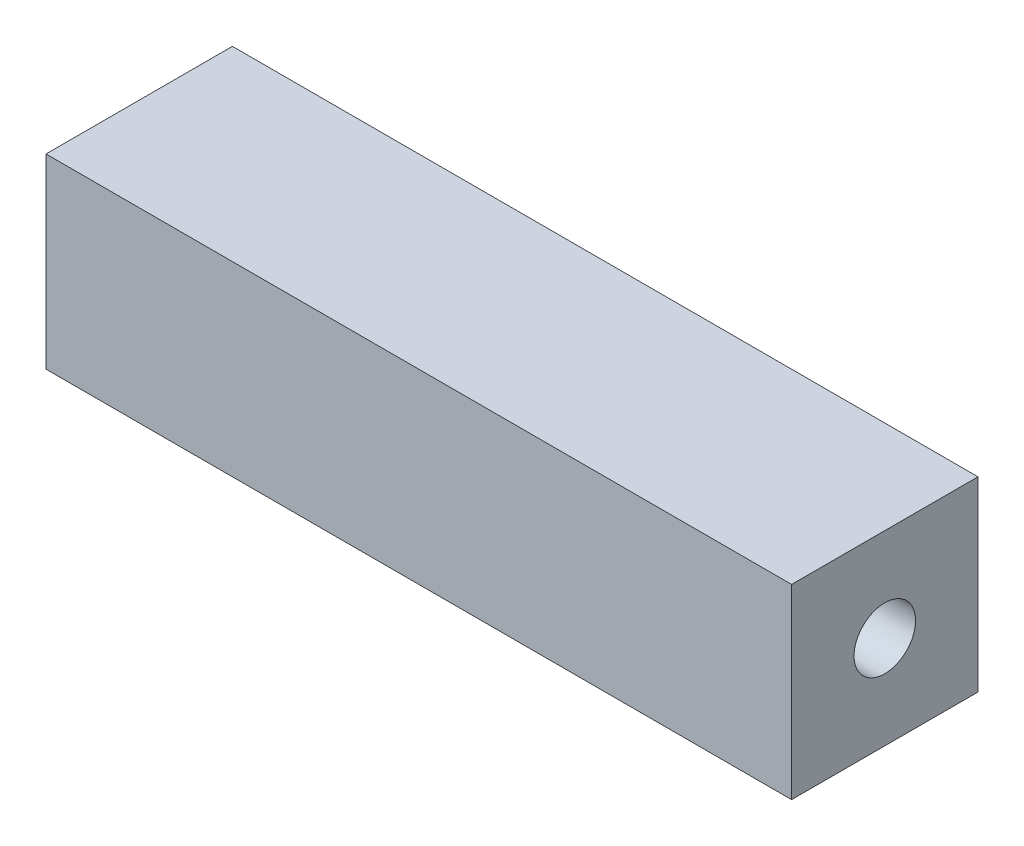
ISO-10303-21;
HEADER;
FILE_DESCRIPTION(('STEP AP214'),'2;1');
FILE_NAME('part.step','',(''),(''),'','','');
FILE_SCHEMA(('AUTOMOTIVE_DESIGN { 1 0 10303 214 1 1 1 1 }'));
ENDSEC;
DATA;
#1=APPLICATION_CONTEXT('core data for automotive mechanical design processes');
#2=APPLICATION_PROTOCOL_DEFINITION('international standard','automotive_design',2000,#1);
#3=PRODUCT_CONTEXT('',#1,'mechanical');
#4=PRODUCT('Part','Part','',(#3));
#5=PRODUCT_RELATED_PRODUCT_CATEGORY('part','',(#4));
#6=PRODUCT_DEFINITION_FORMATION('','',#4);
#7=PRODUCT_DEFINITION_CONTEXT('part definition',#1,'design');
#8=PRODUCT_DEFINITION('design','',#6,#7);
#9=PRODUCT_DEFINITION_SHAPE('','',#8);
#10=(LENGTH_UNIT() NAMED_UNIT(*) SI_UNIT(.MILLI.,.METRE.));
#11=(NAMED_UNIT(*) PLANE_ANGLE_UNIT() SI_UNIT($,.RADIAN.));
#12=(NAMED_UNIT(*) SI_UNIT($,.STERADIAN.) SOLID_ANGLE_UNIT());
#13=UNCERTAINTY_MEASURE_WITH_UNIT(LENGTH_MEASURE(1.E-05),#10,'distance_accuracy_value','');
#14=(GEOMETRIC_REPRESENTATION_CONTEXT(3) GLOBAL_UNCERTAINTY_ASSIGNED_CONTEXT((#13)) GLOBAL_UNIT_ASSIGNED_CONTEXT((#10,
#11,#12)) REPRESENTATION_CONTEXT('',''));
#15=CARTESIAN_POINT('',(0.,0.,0.));
#16=DIRECTION('',(0.,0.,1.));
#17=DIRECTION('',(1.,0.,0.));
#18=AXIS2_PLACEMENT_3D('',#15,#16,#17);
#19=CARTESIAN_POINT('',(20.,10.,-5.));
#20=DIRECTION('',(-1.,0.,0.));
#21=DIRECTION('',(0.,0.,1.));
#22=AXIS2_PLACEMENT_3D('',#19,#20,#21);
#23=PLANE('',#22);
#24=CARTESIAN_POINT('',(20.,5.,0.));
#25=DIRECTION('',(1.,0.,0.));
#26=DIRECTION('',(0.,0.,-1.));
#27=AXIS2_PLACEMENT_3D('',#24,#25,#26);
#28=CIRCLE('',#27,1.65);
#29=CARTESIAN_POINT('',(20.,5.,-1.65));
#30=VERTEX_POINT('',#29);
#31=EDGE_CURVE('E106',#30,#30,#28,.T.);
#32=ORIENTED_EDGE('',*,*,#31,.F.);
#33=EDGE_LOOP('',(#32));
#34=FACE_BOUND('',#33,.T.);
#35=DIRECTION('',(0.,0.,-1.));
#36=VECTOR('',#35,1.);
#37=CARTESIAN_POINT('',(20.,0.,-5.));
#38=LINE('',#37,#36);
#39=CARTESIAN_POINT('',(20.,0.,5.));
#40=VERTEX_POINT('',#39);
#41=CARTESIAN_POINT('',(20.,0.,-5.));
#42=VERTEX_POINT('',#41);
#43=EDGE_CURVE('E117',#40,#42,#38,.T.);
#44=ORIENTED_EDGE('',*,*,#43,.T.);
#45=DIRECTION('',(0.,-1.,0.));
#46=VECTOR('',#45,1.);
#47=CARTESIAN_POINT('',(20.,10.,-5.));
#48=LINE('',#47,#46);
#49=CARTESIAN_POINT('',(20.,10.,-5.));
#50=VERTEX_POINT('',#49);
#51=EDGE_CURVE('E11',#50,#42,#48,.T.);
#52=ORIENTED_EDGE('',*,*,#51,.F.);
#53=DIRECTION('',(0.,0.,-1.));
#54=VECTOR('',#53,1.);
#55=CARTESIAN_POINT('',(20.,10.,-5.));
#56=LINE('',#55,#54);
#57=CARTESIAN_POINT('',(20.,10.,5.));
#58=VERTEX_POINT('',#57);
#59=EDGE_CURVE('E118',#58,#50,#56,.T.);
#60=ORIENTED_EDGE('',*,*,#59,.F.);
#61=DIRECTION('',(0.,-1.,0.));
#62=VECTOR('',#61,1.);
#63=CARTESIAN_POINT('',(20.,10.,5.));
#64=LINE('',#63,#62);
#65=EDGE_CURVE('E124',#58,#40,#64,.T.);
#66=ORIENTED_EDGE('',*,*,#65,.T.);
#67=EDGE_LOOP('',(#44,#52,#60,#66));
#68=FACE_BOUND('',#67,.T.);
#69=ADVANCED_FACE('F42',(#34,#68),#23,.F.);
#70=CARTESIAN_POINT('',(-20.,10.,-5.));
#71=DIRECTION('',(0.,0.,1.));
#72=DIRECTION('',(1.,0.,0.));
#73=AXIS2_PLACEMENT_3D('',#70,#71,#72);
#74=PLANE('',#73);
#75=DIRECTION('',(-1.,0.,0.));
#76=VECTOR('',#75,1.);
#77=CARTESIAN_POINT('',(-20.,0.,-5.));
#78=LINE('',#77,#76);
#79=CARTESIAN_POINT('',(-20.,0.,-5.));
#80=VERTEX_POINT('',#79);
#81=EDGE_CURVE('E127',#42,#80,#78,.T.);
#82=ORIENTED_EDGE('',*,*,#81,.T.);
#83=DIRECTION('',(0.,-1.,0.));
#84=VECTOR('',#83,1.);
#85=CARTESIAN_POINT('',(-20.,10.,-5.));
#86=LINE('',#85,#84);
#87=CARTESIAN_POINT('',(-20.,10.,-5.));
#88=VERTEX_POINT('',#87);
#89=EDGE_CURVE('E50',#88,#80,#86,.T.);
#90=ORIENTED_EDGE('',*,*,#89,.F.);
#91=DIRECTION('',(-1.,0.,0.));
#92=VECTOR('',#91,1.);
#93=CARTESIAN_POINT('',(-20.,10.,-5.));
#94=LINE('',#93,#92);
#95=EDGE_CURVE('E89',#50,#88,#94,.T.);
#96=ORIENTED_EDGE('',*,*,#95,.F.);
#97=ORIENTED_EDGE('',*,*,#51,.T.);
#98=EDGE_LOOP('',(#82,#90,#96,#97));
#99=FACE_BOUND('',#98,.T.);
#100=ADVANCED_FACE('F150',(#99),#74,.F.);
#101=CARTESIAN_POINT('',(-20.,10.,-5.));
#102=DIRECTION('',(1.,0.,0.));
#103=DIRECTION('',(0.,0.,-1.));
#104=AXIS2_PLACEMENT_3D('',#101,#102,#103);
#105=PLANE('',#104);
#106=CARTESIAN_POINT('',(-20.,5.,0.));
#107=DIRECTION('',(-1.,0.,0.));
#108=DIRECTION('',(0.,0.,1.));
#109=AXIS2_PLACEMENT_3D('',#106,#107,#108);
#110=CIRCLE('',#109,1.65);
#111=CARTESIAN_POINT('',(-20.,5.,1.65));
#112=VERTEX_POINT('',#111);
#113=EDGE_CURVE('E107',#112,#112,#110,.T.);
#114=ORIENTED_EDGE('',*,*,#113,.F.);
#115=EDGE_LOOP('',(#114));
#116=FACE_BOUND('',#115,.T.);
#117=DIRECTION('',(0.,0.,1.));
#118=VECTOR('',#117,1.);
#119=CARTESIAN_POINT('',(-20.,0.,-5.));
#120=LINE('',#119,#118);
#121=CARTESIAN_POINT('',(-20.,0.,5.));
#122=VERTEX_POINT('',#121);
#123=EDGE_CURVE('E76',#80,#122,#120,.T.);
#124=ORIENTED_EDGE('',*,*,#123,.T.);
#125=DIRECTION('',(0.,-1.,0.));
#126=VECTOR('',#125,1.);
#127=CARTESIAN_POINT('',(-20.,10.,5.));
#128=LINE('',#127,#126);
#129=CARTESIAN_POINT('',(-20.,10.,5.));
#130=VERTEX_POINT('',#129);
#131=EDGE_CURVE('E132',#130,#122,#128,.T.);
#132=ORIENTED_EDGE('',*,*,#131,.F.);
#133=DIRECTION('',(0.,0.,1.));
#134=VECTOR('',#133,1.);
#135=CARTESIAN_POINT('',(-20.,10.,-5.));
#136=LINE('',#135,#134);
#137=EDGE_CURVE('E121',#88,#130,#136,.T.);
#138=ORIENTED_EDGE('',*,*,#137,.F.);
#139=ORIENTED_EDGE('',*,*,#89,.T.);
#140=EDGE_LOOP('',(#124,#132,#138,#139));
#141=FACE_BOUND('',#140,.T.);
#142=ADVANCED_FACE('F134',(#116,#141),#105,.F.);
#143=CARTESIAN_POINT('',(-20.,10.,5.));
#144=DIRECTION('',(0.,0.,-1.));
#145=DIRECTION('',(-1.,0.,0.));
#146=AXIS2_PLACEMENT_3D('',#143,#144,#145);
#147=PLANE('',#146);
#148=DIRECTION('',(1.,0.,0.));
#149=VECTOR('',#148,1.);
#150=CARTESIAN_POINT('',(-20.,0.,5.));
#151=LINE('',#150,#149);
#152=EDGE_CURVE('E82',#122,#40,#151,.T.);
#153=ORIENTED_EDGE('',*,*,#152,.T.);
#154=ORIENTED_EDGE('',*,*,#65,.F.);
#155=DIRECTION('',(1.,0.,0.));
#156=VECTOR('',#155,1.);
#157=CARTESIAN_POINT('',(-20.,10.,5.));
#158=LINE('',#157,#156);
#159=EDGE_CURVE('E58',#130,#58,#158,.T.);
#160=ORIENTED_EDGE('',*,*,#159,.F.);
#161=ORIENTED_EDGE('',*,*,#131,.T.);
#162=EDGE_LOOP('',(#153,#154,#160,#161));
#163=FACE_BOUND('',#162,.T.);
#164=ADVANCED_FACE('F141',(#163),#147,.F.);
#165=CARTESIAN_POINT('',(0.,10.,0.));
#166=DIRECTION('',(0.,1.,0.));
#167=DIRECTION('',(0.,0.,1.));
#168=AXIS2_PLACEMENT_3D('',#165,#166,#167);
#169=PLANE('',#168);
#170=ORIENTED_EDGE('',*,*,#59,.T.);
#171=ORIENTED_EDGE('',*,*,#95,.T.);
#172=ORIENTED_EDGE('',*,*,#137,.T.);
#173=ORIENTED_EDGE('',*,*,#159,.T.);
#174=EDGE_LOOP('',(#170,#171,#172,#173));
#175=FACE_BOUND('',#174,.T.);
#176=ADVANCED_FACE('F143',(#175),#169,.T.);
#177=CARTESIAN_POINT('',(0.,0.,0.));
#178=DIRECTION('',(0.,1.,0.));
#179=DIRECTION('',(0.,0.,1.));
#180=AXIS2_PLACEMENT_3D('',#177,#178,#179);
#181=PLANE('',#180);
#182=ORIENTED_EDGE('',*,*,#43,.F.);
#183=ORIENTED_EDGE('',*,*,#152,.F.);
#184=ORIENTED_EDGE('',*,*,#123,.F.);
#185=ORIENTED_EDGE('',*,*,#81,.F.);
#186=EDGE_LOOP('',(#182,#183,#184,#185));
#187=FACE_BOUND('',#186,.T.);
#188=ADVANCED_FACE('F137',(#187),#181,.F.);
#189=CARTESIAN_POINT('',(4.,5.,0.));
#190=DIRECTION('',(1.,0.,0.));
#191=DIRECTION('',(0.,0.,-1.));
#192=AXIS2_PLACEMENT_3D('',#189,#190,#191);
#193=CONICAL_SURFACE('',#192,1.65,1.02974425867665);
#194=CARTESIAN_POINT('',(3.00857997860453,5.,0.));
#195=VERTEX_POINT('',#194);
#196=VERTEX_LOOP('',#195);
#197=FACE_BOUND('',#196,.T.);
#198=CARTESIAN_POINT('',(4.,5.,0.));
#199=DIRECTION('',(1.,0.,0.));
#200=DIRECTION('',(0.,0.,-1.));
#201=AXIS2_PLACEMENT_3D('',#198,#199,#200);
#202=CIRCLE('',#201,1.65);
#203=CARTESIAN_POINT('',(4.,5.,-1.65));
#204=VERTEX_POINT('',#203);
#205=EDGE_CURVE('E110',#204,#204,#202,.T.);
#206=ORIENTED_EDGE('',*,*,#205,.T.);
#207=EDGE_LOOP('',(#206));
#208=FACE_BOUND('',#207,.T.);
#209=ADVANCED_FACE('F162',(#197,#208),#193,.F.);
#210=CARTESIAN_POINT('',(20.,5.,0.));
#211=DIRECTION('',(1.,0.,0.));
#212=DIRECTION('',(0.,0.,-1.));
#213=AXIS2_PLACEMENT_3D('',#210,#211,#212);
#214=CYLINDRICAL_SURFACE('',#213,1.65);
#215=ORIENTED_EDGE('',*,*,#205,.F.);
#216=EDGE_LOOP('',(#215));
#217=FACE_BOUND('',#216,.T.);
#218=ORIENTED_EDGE('',*,*,#31,.T.);
#219=EDGE_LOOP('',(#218));
#220=FACE_BOUND('',#219,.T.);
#221=ADVANCED_FACE('F100',(#217,#220),#214,.F.);
#222=CARTESIAN_POINT('',(-4.,5.,0.));
#223=DIRECTION('',(-1.,0.,0.));
#224=DIRECTION('',(0.,0.,1.));
#225=AXIS2_PLACEMENT_3D('',#222,#223,#224);
#226=CONICAL_SURFACE('',#225,1.65,1.02974425867665);
#227=CARTESIAN_POINT('',(-3.00857997860452,5.,0.));
#228=VERTEX_POINT('',#227);
#229=VERTEX_LOOP('',#228);
#230=FACE_BOUND('',#229,.T.);
#231=CARTESIAN_POINT('',(-4.,5.,0.));
#232=DIRECTION('',(-1.,0.,0.));
#233=DIRECTION('',(0.,0.,1.));
#234=AXIS2_PLACEMENT_3D('',#231,#232,#233);
#235=CIRCLE('',#234,1.65);
#236=CARTESIAN_POINT('',(-4.,5.,1.65));
#237=VERTEX_POINT('',#236);
#238=EDGE_CURVE('E104',#237,#237,#235,.T.);
#239=ORIENTED_EDGE('',*,*,#238,.T.);
#240=EDGE_LOOP('',(#239));
#241=FACE_BOUND('',#240,.T.);
#242=ADVANCED_FACE('F96',(#230,#241),#226,.F.);
#243=CARTESIAN_POINT('',(-20.,5.,0.));
#244=DIRECTION('',(-1.,0.,0.));
#245=DIRECTION('',(0.,0.,1.));
#246=AXIS2_PLACEMENT_3D('',#243,#244,#245);
#247=CYLINDRICAL_SURFACE('',#246,1.65);
#248=ORIENTED_EDGE('',*,*,#238,.F.);
#249=EDGE_LOOP('',(#248));
#250=FACE_BOUND('',#249,.T.);
#251=ORIENTED_EDGE('',*,*,#113,.T.);
#252=EDGE_LOOP('',(#251));
#253=FACE_BOUND('',#252,.T.);
#254=ADVANCED_FACE('F99',(#250,#253),#247,.F.);
#255=CLOSED_SHELL('',(#69,#100,#142,#164,#176,#188,#209,#221,#242,#254));
#256=MANIFOLD_SOLID_BREP('B2',#255);
#257=ADVANCED_BREP_SHAPE_REPRESENTATION('',(#18,#256),#14);
#258=SHAPE_DEFINITION_REPRESENTATION(#9,#257);
ENDSEC;
END-ISO-10303-21;
